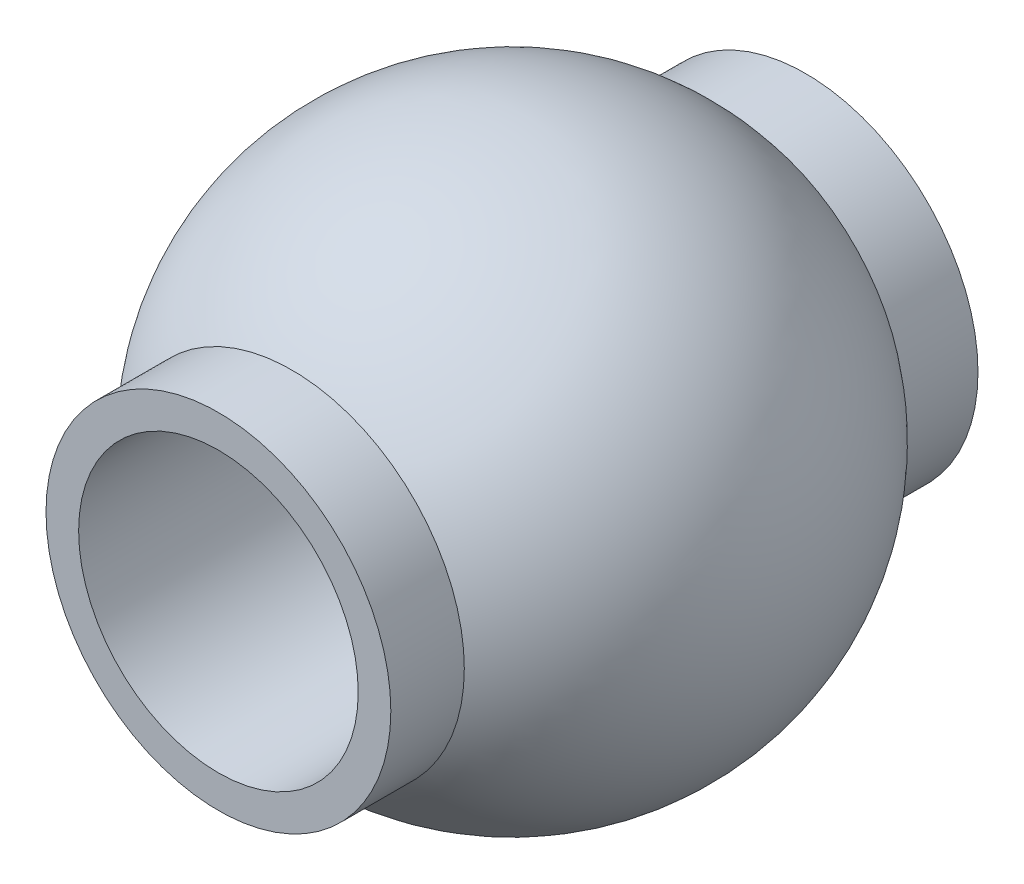
ISO-10303-21;
HEADER;
FILE_DESCRIPTION(('STEP AP214'),'2;1');
FILE_NAME('part.step','',(''),(''),'','','');
FILE_SCHEMA(('AUTOMOTIVE_DESIGN { 1 0 10303 214 1 1 1 1 }'));
ENDSEC;
DATA;
#1=APPLICATION_CONTEXT('core data for automotive mechanical design processes');
#2=APPLICATION_PROTOCOL_DEFINITION('international standard','automotive_design',2000,#1);
#3=PRODUCT_CONTEXT('',#1,'mechanical');
#4=PRODUCT('Part','Part','',(#3));
#5=PRODUCT_RELATED_PRODUCT_CATEGORY('part','',(#4));
#6=PRODUCT_DEFINITION_FORMATION('','',#4);
#7=PRODUCT_DEFINITION_CONTEXT('part definition',#1,'design');
#8=PRODUCT_DEFINITION('design','',#6,#7);
#9=PRODUCT_DEFINITION_SHAPE('','',#8);
#10=(LENGTH_UNIT() NAMED_UNIT(*) SI_UNIT(.MILLI.,.METRE.));
#11=(NAMED_UNIT(*) PLANE_ANGLE_UNIT() SI_UNIT($,.RADIAN.));
#12=(NAMED_UNIT(*) SI_UNIT($,.STERADIAN.) SOLID_ANGLE_UNIT());
#13=UNCERTAINTY_MEASURE_WITH_UNIT(LENGTH_MEASURE(1.E-05),#10,'distance_accuracy_value','');
#14=(GEOMETRIC_REPRESENTATION_CONTEXT(3) GLOBAL_UNCERTAINTY_ASSIGNED_CONTEXT((#13)) GLOBAL_UNIT_ASSIGNED_CONTEXT((#10,
#11,#12)) REPRESENTATION_CONTEXT('',''));
#15=CARTESIAN_POINT('',(0.,0.,0.));
#16=DIRECTION('',(0.,0.,1.));
#17=DIRECTION('',(1.,0.,0.));
#18=AXIS2_PLACEMENT_3D('',#15,#16,#17);
#19=CARTESIAN_POINT('',(0.,0.,0.));
#20=DIRECTION('',(0.,-1.,0.));
#21=DIRECTION('',(-1.,0.,0.));
#22=AXIS2_PLACEMENT_3D('',#19,#20,#21);
#23=SPHERICAL_SURFACE('',#22,3.);
#24=CARTESIAN_POINT('',(0.,0.,0.));
#25=DIRECTION('',(0.,0.,-1.));
#26=DIRECTION('',(-1.,0.,0.));
#27=AXIS2_PLACEMENT_3D('',#24,#25,#26);
#28=SPHERICAL_SURFACE('',#27,3.);
#29=CARTESIAN_POINT('',(0.,0.,2.36167313572391));
#30=DIRECTION('',(0.,0.,-1.));
#31=DIRECTION('',(-1.,0.,0.));
#32=AXIS2_PLACEMENT_3D('',#29,#30,#31);
#33=CIRCLE('',#32,1.85);
#34=CARTESIAN_POINT('',(-1.85,0.,2.36167313572391));
#35=VERTEX_POINT('',#34);
#36=EDGE_CURVE('E39',#35,#35,#33,.T.);
#37=ORIENTED_EDGE('',*,*,#36,.T.);
#38=EDGE_LOOP('',(#37));
#39=FACE_BOUND('',#38,.T.);
#40=CARTESIAN_POINT('',(0.,0.,-2.36167313572391));
#41=DIRECTION('',(0.,0.,1.));
#42=DIRECTION('',(1.,0.,0.));
#43=AXIS2_PLACEMENT_3D('',#40,#41,#42);
#44=CIRCLE('',#43,1.85);
#45=CARTESIAN_POINT('',(1.85,0.,-2.36167313572391));
#46=VERTEX_POINT('',#45);
#47=EDGE_CURVE('E10',#46,#46,#44,.T.);
#48=ORIENTED_EDGE('',*,*,#47,.T.);
#49=EDGE_LOOP('',(#48));
#50=FACE_BOUND('',#49,.T.);
#51=ADVANCED_FACE('F33',(#39,#50),#28,.T.);
#52=CARTESIAN_POINT('',(0.,0.,3.15));
#53=DIRECTION('',(0.,0.,-1.));
#54=DIRECTION('',(-1.,0.,0.));
#55=AXIS2_PLACEMENT_3D('',#52,#53,#54);
#56=CYLINDRICAL_SURFACE('',#55,1.85);
#57=ORIENTED_EDGE('',*,*,#36,.F.);
#58=EDGE_LOOP('',(#57));
#59=FACE_BOUND('',#58,.T.);
#60=CARTESIAN_POINT('',(0.,0.,3.15));
#61=DIRECTION('',(0.,0.,1.));
#62=DIRECTION('',(1.,0.,0.));
#63=AXIS2_PLACEMENT_3D('',#60,#61,#62);
#64=CIRCLE('',#63,1.85);
#65=CARTESIAN_POINT('',(1.85,0.,3.15));
#66=VERTEX_POINT('',#65);
#67=EDGE_CURVE('E43',#66,#66,#64,.T.);
#68=ORIENTED_EDGE('',*,*,#67,.F.);
#69=EDGE_LOOP('',(#68));
#70=FACE_BOUND('',#69,.T.);
#71=ADVANCED_FACE('F64',(#59,#70),#56,.T.);
#72=CARTESIAN_POINT('',(0.,0.,3.15));
#73=DIRECTION('',(0.,0.,1.));
#74=DIRECTION('',(1.,0.,0.));
#75=AXIS2_PLACEMENT_3D('',#72,#73,#74);
#76=PLANE('',#75);
#77=ORIENTED_EDGE('',*,*,#67,.T.);
#78=EDGE_LOOP('',(#77));
#79=FACE_BOUND('',#78,.T.);
#80=CARTESIAN_POINT('',(0.,0.,3.15));
#81=DIRECTION('',(0.,0.,1.));
#82=DIRECTION('',(1.,0.,0.));
#83=AXIS2_PLACEMENT_3D('',#80,#81,#82);
#84=CIRCLE('',#83,1.5);
#85=CARTESIAN_POINT('',(1.5,0.,3.15));
#86=VERTEX_POINT('',#85);
#87=EDGE_CURVE('E51',#86,#86,#84,.T.);
#88=ORIENTED_EDGE('',*,*,#87,.F.);
#89=EDGE_LOOP('',(#88));
#90=FACE_BOUND('',#89,.T.);
#91=ADVANCED_FACE('F61',(#79,#90),#76,.T.);
#92=ORIENTED_EDGE('',*,*,#47,.F.);
#93=EDGE_LOOP('',(#92));
#94=FACE_BOUND('',#93,.T.);
#95=CARTESIAN_POINT('',(0.,0.,-3.15));
#96=DIRECTION('',(0.,0.,1.));
#97=DIRECTION('',(1.,0.,0.));
#98=AXIS2_PLACEMENT_3D('',#95,#96,#97);
#99=CIRCLE('',#98,1.85);
#100=CARTESIAN_POINT('',(1.85,0.,-3.15));
#101=VERTEX_POINT('',#100);
#102=EDGE_CURVE('E47',#101,#101,#99,.T.);
#103=ORIENTED_EDGE('',*,*,#102,.T.);
#104=EDGE_LOOP('',(#103));
#105=FACE_BOUND('',#104,.T.);
#106=ADVANCED_FACE('F63',(#94,#105),#56,.T.);
#107=CARTESIAN_POINT('',(0.,0.,3.15));
#108=DIRECTION('',(0.,0.,-1.));
#109=DIRECTION('',(-1.,0.,0.));
#110=AXIS2_PLACEMENT_3D('',#107,#108,#109);
#111=CYLINDRICAL_SURFACE('',#110,1.5);
#112=CARTESIAN_POINT('',(0.,0.,-3.15));
#113=DIRECTION('',(0.,0.,1.));
#114=DIRECTION('',(1.,0.,0.));
#115=AXIS2_PLACEMENT_3D('',#112,#113,#114);
#116=CIRCLE('',#115,1.5);
#117=CARTESIAN_POINT('',(1.5,0.,-3.15));
#118=VERTEX_POINT('',#117);
#119=EDGE_CURVE('E53',#118,#118,#116,.T.);
#120=ORIENTED_EDGE('',*,*,#119,.F.);
#121=EDGE_LOOP('',(#120));
#122=FACE_BOUND('',#121,.T.);
#123=ORIENTED_EDGE('',*,*,#87,.T.);
#124=EDGE_LOOP('',(#123));
#125=FACE_BOUND('',#124,.T.);
#126=ADVANCED_FACE('F59',(#122,#125),#111,.F.);
#127=CARTESIAN_POINT('',(0.,0.,-3.15));
#128=DIRECTION('',(0.,0.,1.));
#129=DIRECTION('',(1.,0.,0.));
#130=AXIS2_PLACEMENT_3D('',#127,#128,#129);
#131=PLANE('',#130);
#132=ORIENTED_EDGE('',*,*,#102,.F.);
#133=EDGE_LOOP('',(#132));
#134=FACE_BOUND('',#133,.T.);
#135=ORIENTED_EDGE('',*,*,#119,.T.);
#136=EDGE_LOOP('',(#135));
#137=FACE_BOUND('',#136,.T.);
#138=ADVANCED_FACE('F99',(#134,#137),#131,.F.);
#139=CLOSED_SHELL('',(#51,#71,#91,#106,#126,#138));
#140=MANIFOLD_SOLID_BREP('B2',#139);
#141=ADVANCED_BREP_SHAPE_REPRESENTATION('',(#18,#140),#14);
#142=SHAPE_DEFINITION_REPRESENTATION(#9,#141);
ENDSEC;
END-ISO-10303-21;
